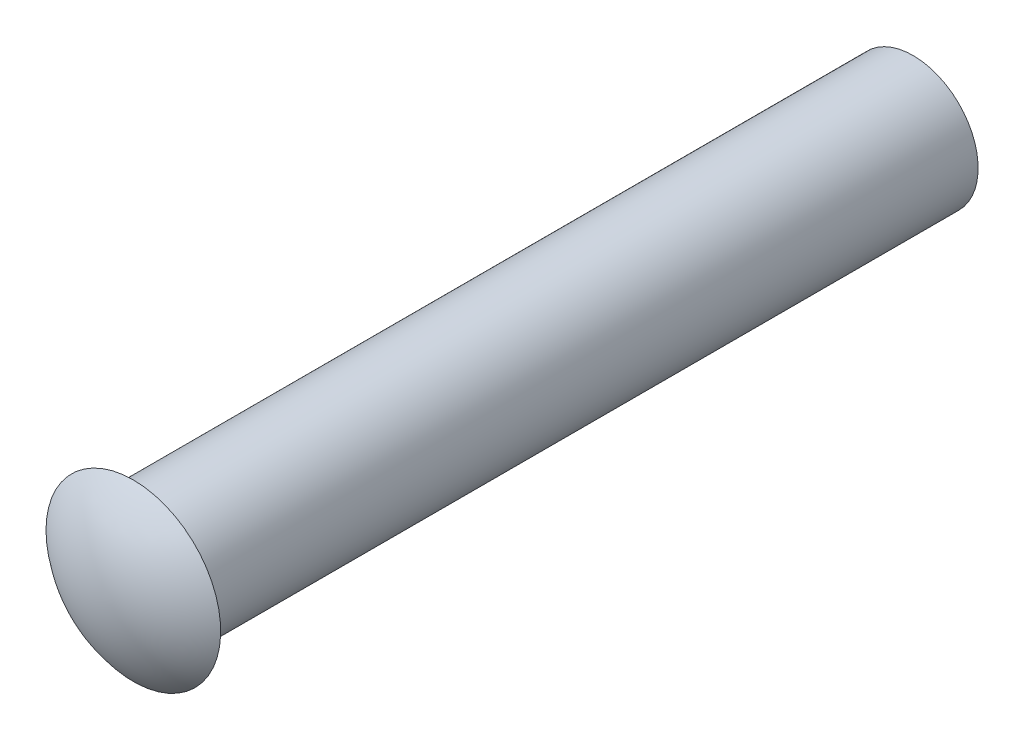
ISO-10303-21;
HEADER;
FILE_DESCRIPTION(('STEP AP214'),'2;1');
FILE_NAME('part.step','',(''),(''),'','','');
FILE_SCHEMA(('AUTOMOTIVE_DESIGN { 1 0 10303 214 1 1 1 1 }'));
ENDSEC;
DATA;
#1=APPLICATION_CONTEXT('core data for automotive mechanical design processes');
#2=APPLICATION_PROTOCOL_DEFINITION('international standard','automotive_design',2000,#1);
#3=PRODUCT_CONTEXT('',#1,'mechanical');
#4=PRODUCT('Part','Part','',(#3));
#5=PRODUCT_RELATED_PRODUCT_CATEGORY('part','',(#4));
#6=PRODUCT_DEFINITION_FORMATION('','',#4);
#7=PRODUCT_DEFINITION_CONTEXT('part definition',#1,'design');
#8=PRODUCT_DEFINITION('design','',#6,#7);
#9=PRODUCT_DEFINITION_SHAPE('','',#8);
#10=(LENGTH_UNIT() NAMED_UNIT(*) SI_UNIT(.MILLI.,.METRE.));
#11=(NAMED_UNIT(*) PLANE_ANGLE_UNIT() SI_UNIT($,.RADIAN.));
#12=(NAMED_UNIT(*) SI_UNIT($,.STERADIAN.) SOLID_ANGLE_UNIT());
#13=UNCERTAINTY_MEASURE_WITH_UNIT(LENGTH_MEASURE(1.E-05),#10,'distance_accuracy_value','');
#14=(GEOMETRIC_REPRESENTATION_CONTEXT(3) GLOBAL_UNCERTAINTY_ASSIGNED_CONTEXT((#13)) GLOBAL_UNIT_ASSIGNED_CONTEXT((#10,
#11,#12)) REPRESENTATION_CONTEXT('',''));
#15=CARTESIAN_POINT('',(0.,0.,0.));
#16=DIRECTION('',(0.,0.,1.));
#17=DIRECTION('',(1.,0.,0.));
#18=AXIS2_PLACEMENT_3D('',#15,#16,#17);
#19=CARTESIAN_POINT('',(0.,1.5875,-19.8374));
#20=DIRECTION('',(0.,0.,-1.));
#21=DIRECTION('',(-1.,0.,0.));
#22=AXIS2_PLACEMENT_3D('',#19,#20,#21);
#23=PLANE('',#22);
#24=CARTESIAN_POINT('',(0.,0.,-19.8374));
#25=DIRECTION('',(0.,0.,-1.));
#26=DIRECTION('',(-1.,0.,0.));
#27=AXIS2_PLACEMENT_3D('',#24,#25,#26);
#28=CIRCLE('',#27,1.5875);
#29=CARTESIAN_POINT('',(-1.5875,0.,-19.8374));
#30=VERTEX_POINT('',#29);
#31=EDGE_CURVE('E41',#30,#30,#28,.T.);
#32=ORIENTED_EDGE('',*,*,#31,.T.);
#33=EDGE_LOOP('',(#32));
#34=FACE_BOUND('',#33,.T.);
#35=ADVANCED_FACE('F31',(#34),#23,.T.);
#36=CARTESIAN_POINT('',(0.,0.,-3.28438387096774));
#37=DIRECTION('',(0.,0.,-1.));
#38=DIRECTION('',(0.,1.,0.));
#39=AXIS2_PLACEMENT_3D('',#36,#37,#38);
#40=SPHERICAL_SURFACE('',#39,3.28438387096774);
#41=CARTESIAN_POINT('',(0.,0.,-0.787400000000001));
#42=DIRECTION('',(0.,0.,-1.));
#43=DIRECTION('',(-1.,0.,0.));
#44=AXIS2_PLACEMENT_3D('',#41,#42,#43);
#45=CIRCLE('',#44,2.1336);
#46=CARTESIAN_POINT('',(-2.1336,0.,-0.787400000000001));
#47=VERTEX_POINT('',#46);
#48=EDGE_CURVE('E10',#47,#47,#45,.T.);
#49=ORIENTED_EDGE('',*,*,#48,.F.);
#50=EDGE_LOOP('',(#49));
#51=FACE_BOUND('',#50,.T.);
#52=ADVANCED_FACE('F56',(#51),#40,.T.);
#53=CARTESIAN_POINT('',(0.,2.1336,-0.7874));
#54=DIRECTION('',(0.,0.,-1.));
#55=DIRECTION('',(-1.,0.,0.));
#56=AXIS2_PLACEMENT_3D('',#53,#54,#55);
#57=PLANE('',#56);
#58=ORIENTED_EDGE('',*,*,#48,.T.);
#59=EDGE_LOOP('',(#58));
#60=FACE_BOUND('',#59,.T.);
#61=CARTESIAN_POINT('',(0.,0.,-0.787400000000001));
#62=DIRECTION('',(0.,0.,-1.));
#63=DIRECTION('',(-1.,0.,0.));
#64=AXIS2_PLACEMENT_3D('',#61,#62,#63);
#65=CIRCLE('',#64,1.5875);
#66=CARTESIAN_POINT('',(-1.5875,0.,-0.787400000000001));
#67=VERTEX_POINT('',#66);
#68=EDGE_CURVE('E37',#67,#67,#65,.T.);
#69=ORIENTED_EDGE('',*,*,#68,.F.);
#70=EDGE_LOOP('',(#69));
#71=FACE_BOUND('',#70,.T.);
#72=ADVANCED_FACE('F51',(#60,#71),#57,.T.);
#73=CARTESIAN_POINT('',(0.,0.,-19.8374));
#74=DIRECTION('',(0.,0.,-1.));
#75=DIRECTION('',(-1.,0.,0.));
#76=AXIS2_PLACEMENT_3D('',#73,#74,#75);
#77=CYLINDRICAL_SURFACE('',#76,1.5875);
#78=ORIENTED_EDGE('',*,*,#68,.T.);
#79=EDGE_LOOP('',(#78));
#80=FACE_BOUND('',#79,.T.);
#81=ORIENTED_EDGE('',*,*,#31,.F.);
#82=EDGE_LOOP('',(#81));
#83=FACE_BOUND('',#82,.T.);
#84=ADVANCED_FACE('F49',(#80,#83),#77,.T.);
#85=CLOSED_SHELL('',(#35,#52,#72,#84));
#86=MANIFOLD_SOLID_BREP('B2',#85);
#87=ADVANCED_BREP_SHAPE_REPRESENTATION('',(#18,#86),#14);
#88=SHAPE_DEFINITION_REPRESENTATION(#9,#87);
ENDSEC;
END-ISO-10303-21;
